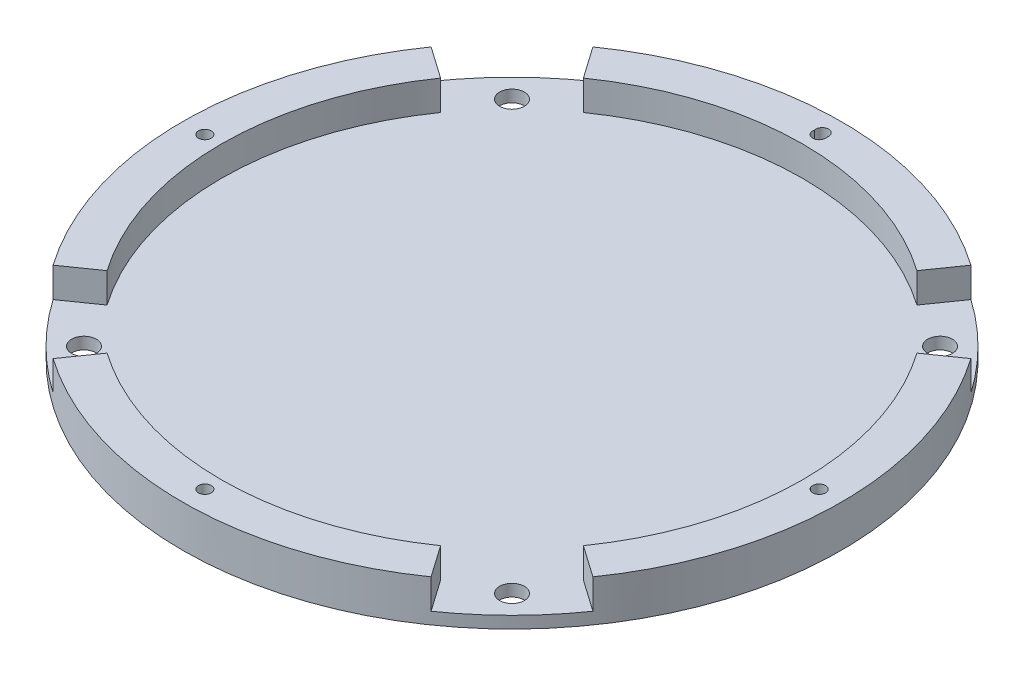
ISO-10303-21;
HEADER;
FILE_DESCRIPTION(('STEP AP214'),'2;1');
FILE_NAME('part.step','',(''),(''),'','','');
FILE_SCHEMA(('AUTOMOTIVE_DESIGN { 1 0 10303 214 1 1 1 1 }'));
ENDSEC;
DATA;
#1=APPLICATION_CONTEXT('core data for automotive mechanical design processes');
#2=APPLICATION_PROTOCOL_DEFINITION('international standard','automotive_design',2000,#1);
#3=PRODUCT_CONTEXT('',#1,'mechanical');
#4=PRODUCT('Part','Part','',(#3));
#5=PRODUCT_RELATED_PRODUCT_CATEGORY('part','',(#4));
#6=PRODUCT_DEFINITION_FORMATION('','',#4);
#7=PRODUCT_DEFINITION_CONTEXT('part definition',#1,'design');
#8=PRODUCT_DEFINITION('design','',#6,#7);
#9=PRODUCT_DEFINITION_SHAPE('','',#8);
#10=(LENGTH_UNIT() NAMED_UNIT(*) SI_UNIT(.MILLI.,.METRE.));
#11=(NAMED_UNIT(*) PLANE_ANGLE_UNIT() SI_UNIT($,.RADIAN.));
#12=(NAMED_UNIT(*) SI_UNIT($,.STERADIAN.) SOLID_ANGLE_UNIT());
#13=UNCERTAINTY_MEASURE_WITH_UNIT(LENGTH_MEASURE(1.E-05),#10,'distance_accuracy_value','');
#14=(GEOMETRIC_REPRESENTATION_CONTEXT(3) GLOBAL_UNCERTAINTY_ASSIGNED_CONTEXT((#13)) GLOBAL_UNIT_ASSIGNED_CONTEXT((#10,
#11,#12)) REPRESENTATION_CONTEXT('',''));
#15=CARTESIAN_POINT('',(0.,0.,0.));
#16=DIRECTION('',(0.,0.,1.));
#17=DIRECTION('',(1.,0.,0.));
#18=AXIS2_PLACEMENT_3D('',#15,#16,#17);
#19=CARTESIAN_POINT('',(0.,4.,0.));
#20=DIRECTION('',(0.,1.,0.));
#21=DIRECTION('',(0.,0.,1.));
#22=AXIS2_PLACEMENT_3D('',#19,#20,#21);
#23=PLANE('',#22);
#24=CARTESIAN_POINT('',(71.7713382904342,4.,71.7713382904349));
#25=DIRECTION('',(0.,1.,0.));
#26=DIRECTION('',(0.,0.,1.));
#27=AXIS2_PLACEMENT_3D('',#24,#25,#26);
#28=CIRCLE('',#27,4.14999999999998);
#29=CARTESIAN_POINT('',(71.7713382904342,4.,75.9213382904349));
#30=VERTEX_POINT('',#29);
#31=EDGE_CURVE('E378',#30,#30,#28,.T.);
#32=ORIENTED_EDGE('',*,*,#31,.F.);
#33=EDGE_LOOP('',(#32));
#34=FACE_BOUND('',#33,.T.);
#35=CARTESIAN_POINT('',(-71.7713382904342,4.,-71.7713382904349));
#36=DIRECTION('',(0.,1.,0.));
#37=DIRECTION('',(0.,0.,1.));
#38=AXIS2_PLACEMENT_3D('',#35,#36,#37);
#39=CIRCLE('',#38,4.15);
#40=CARTESIAN_POINT('',(-71.7713382904342,4.,-67.6213382904349));
#41=VERTEX_POINT('',#40);
#42=EDGE_CURVE('E394',#41,#41,#39,.T.);
#43=ORIENTED_EDGE('',*,*,#42,.F.);
#44=EDGE_LOOP('',(#43));
#45=FACE_BOUND('',#44,.T.);
#46=CARTESIAN_POINT('',(71.7713382904349,4.,-71.7713382904342));
#47=DIRECTION('',(0.,1.,0.));
#48=DIRECTION('',(0.,0.,1.));
#49=AXIS2_PLACEMENT_3D('',#46,#47,#48);
#50=CIRCLE('',#49,4.15);
#51=CARTESIAN_POINT('',(71.7713382904349,4.,-67.6213382904342));
#52=VERTEX_POINT('',#51);
#53=EDGE_CURVE('E386',#52,#52,#50,.T.);
#54=ORIENTED_EDGE('',*,*,#53,.F.);
#55=EDGE_LOOP('',(#54));
#56=FACE_BOUND('',#55,.T.);
#57=CARTESIAN_POINT('',(-71.7713382904349,4.,71.7713382904342));
#58=DIRECTION('',(0.,1.,0.));
#59=DIRECTION('',(0.,0.,1.));
#60=AXIS2_PLACEMENT_3D('',#57,#58,#59);
#61=CIRCLE('',#60,4.15000000000001);
#62=CARTESIAN_POINT('',(-71.7713382904349,4.,75.9213382904342));
#63=VERTEX_POINT('',#62);
#64=EDGE_CURVE('E370',#63,#63,#61,.T.);
#65=ORIENTED_EDGE('',*,*,#64,.F.);
#66=EDGE_LOOP('',(#65));
#67=FACE_BOUND('',#66,.T.);
#68=CARTESIAN_POINT('',(0.,4.,0.));
#69=DIRECTION('',(0.,1.,0.));
#70=DIRECTION('',(0.,0.,1.));
#71=AXIS2_PLACEMENT_3D('',#68,#69,#70);
#72=CIRCLE('',#71,110.5);
#73=CARTESIAN_POINT('',(-63.3801962167911,4.,-90.5163008939333));
#74=VERTEX_POINT('',#73);
#75=CARTESIAN_POINT('',(-90.5163008939334,4.,-63.3801962167909));
#76=VERTEX_POINT('',#75);
#77=EDGE_CURVE('E11',#74,#76,#72,.T.);
#78=ORIENTED_EDGE('',*,*,#77,.T.);
#79=DIRECTION('',(-0.819152044288995,0.,-0.573576436351042));
#80=VECTOR('',#79,1.);
#81=CARTESIAN_POINT('',(5.09438212815498E-13,4.,-7.27553168190726E-13));
#82=LINE('',#81,#80);
#83=CARTESIAN_POINT('',(-79.8673243181765,4.,-55.9237025442273));
#84=VERTEX_POINT('',#83);
#85=EDGE_CURVE('E62',#84,#76,#82,.T.);
#86=ORIENTED_EDGE('',*,*,#85,.F.);
#87=CARTESIAN_POINT('',(0.,4.,0.));
#88=DIRECTION('',(0.,1.,0.));
#89=DIRECTION('',(0.,0.,1.));
#90=AXIS2_PLACEMENT_3D('',#87,#88,#89);
#91=CIRCLE('',#90,97.5);
#92=CARTESIAN_POINT('',(-79.8673243181764,4.,55.9237025442275));
#93=VERTEX_POINT('',#92);
#94=EDGE_CURVE('E67',#84,#93,#91,.T.);
#95=ORIENTED_EDGE('',*,*,#94,.T.);
#96=DIRECTION('',(-0.819152044288988,0.,0.573576436351052));
#97=VECTOR('',#96,1.);
#98=CARTESIAN_POINT('',(0.,4.,0.));
#99=LINE('',#98,#97);
#100=CARTESIAN_POINT('',(-90.5163008939332,4.,63.3801962167912));
#101=VERTEX_POINT('',#100);
#102=EDGE_CURVE('E196',#93,#101,#99,.T.);
#103=ORIENTED_EDGE('',*,*,#102,.T.);
#104=CARTESIAN_POINT('',(-63.3801962167914,4.,90.5163008939331));
#105=VERTEX_POINT('',#104);
#106=EDGE_CURVE('E55',#101,#105,#72,.T.);
#107=ORIENTED_EDGE('',*,*,#106,.T.);
#108=DIRECTION('',(-0.573576436351053,0.,0.819152044288987));
#109=VECTOR('',#108,1.);
#110=CARTESIAN_POINT('',(0.,4.,0.));
#111=LINE('',#110,#109);
#112=CARTESIAN_POINT('',(-55.9237025442277,4.,79.8673243181762));
#113=VERTEX_POINT('',#112);
#114=EDGE_CURVE('E244',#113,#105,#111,.T.);
#115=ORIENTED_EDGE('',*,*,#114,.F.);
#116=CARTESIAN_POINT('',(0.,4.,0.));
#117=DIRECTION('',(0.,1.,0.));
#118=DIRECTION('',(0.,0.,1.));
#119=AXIS2_PLACEMENT_3D('',#116,#117,#118);
#120=CIRCLE('',#119,97.5);
#121=CARTESIAN_POINT('',(55.9237025442275,4.,79.8673243181763));
#122=VERTEX_POINT('',#121);
#123=EDGE_CURVE('E179',#113,#122,#120,.T.);
#124=ORIENTED_EDGE('',*,*,#123,.T.);
#125=DIRECTION('',(0.573576436351042,0.,0.819152044288994));
#126=VECTOR('',#125,1.);
#127=CARTESIAN_POINT('',(8.81021414605957E-13,4.,-6.16897835831267E-13));
#128=LINE('',#127,#126);
#129=CARTESIAN_POINT('',(63.3801962167911,4.,90.5163008939333));
#130=VERTEX_POINT('',#129);
#131=EDGE_CURVE('E227',#122,#130,#128,.T.);
#132=ORIENTED_EDGE('',*,*,#131,.T.);
#133=CARTESIAN_POINT('',(90.5163008939333,4.,63.380196216791));
#134=VERTEX_POINT('',#133);
#135=EDGE_CURVE('E427',#130,#134,#72,.T.);
#136=ORIENTED_EDGE('',*,*,#135,.T.);
#137=DIRECTION('',(0.819152044288989,0.,0.57357643635105));
#138=VECTOR('',#137,1.);
#139=CARTESIAN_POINT('',(0.,4.,0.));
#140=LINE('',#139,#138);
#141=CARTESIAN_POINT('',(79.8673243181764,4.,55.9237025442274));
#142=VERTEX_POINT('',#141);
#143=EDGE_CURVE('E289',#142,#134,#140,.T.);
#144=ORIENTED_EDGE('',*,*,#143,.F.);
#145=CARTESIAN_POINT('',(0.,4.,0.));
#146=DIRECTION('',(0.,1.,0.));
#147=DIRECTION('',(0.,0.,1.));
#148=AXIS2_PLACEMENT_3D('',#145,#146,#147);
#149=CIRCLE('',#148,97.5);
#150=CARTESIAN_POINT('',(79.8673243181768,4.,-55.9237025442269));
#151=VERTEX_POINT('',#150);
#152=EDGE_CURVE('E266',#142,#151,#149,.T.);
#153=ORIENTED_EDGE('',*,*,#152,.T.);
#154=DIRECTION('',(0.819152044288993,0.,-0.573576436351045));
#155=VECTOR('',#154,1.);
#156=CARTESIAN_POINT('',(0.,4.,0.));
#157=LINE('',#156,#155);
#158=CARTESIAN_POINT('',(90.5163008939337,4.,-63.3801962167905));
#159=VERTEX_POINT('',#158);
#160=EDGE_CURVE('E272',#151,#159,#157,.T.);
#161=ORIENTED_EDGE('',*,*,#160,.T.);
#162=CARTESIAN_POINT('',(63.3801962167907,4.,-90.5163008939335));
#163=VERTEX_POINT('',#162);
#164=EDGE_CURVE('E56',#159,#163,#72,.T.);
#165=ORIENTED_EDGE('',*,*,#164,.T.);
#166=DIRECTION('',(0.573576436351047,0.,-0.819152044288991));
#167=VECTOR('',#166,1.);
#168=CARTESIAN_POINT('',(0.,4.,0.));
#169=LINE('',#168,#167);
#170=CARTESIAN_POINT('',(55.9237025442271,4.,-79.8673243181766));
#171=VERTEX_POINT('',#170);
#172=EDGE_CURVE('E342',#171,#163,#169,.T.);
#173=ORIENTED_EDGE('',*,*,#172,.F.);
#174=CARTESIAN_POINT('',(0.,4.,0.));
#175=DIRECTION('',(0.,1.,0.));
#176=DIRECTION('',(0.,0.,1.));
#177=AXIS2_PLACEMENT_3D('',#174,#175,#176);
#178=CIRCLE('',#177,97.5);
#179=CARTESIAN_POINT('',(-55.9237025442275,4.,-79.8673243181763));
#180=VERTEX_POINT('',#179);
#181=EDGE_CURVE('E339',#171,#180,#178,.T.);
#182=ORIENTED_EDGE('',*,*,#181,.T.);
#183=DIRECTION('',(-0.573576436351048,0.,-0.81915204428899));
#184=VECTOR('',#183,1.);
#185=CARTESIAN_POINT('',(-2.72832438071521E-13,4.,1.91039329805814E-13));
#186=LINE('',#185,#184);
#187=EDGE_CURVE('E317',#180,#74,#186,.T.);
#188=ORIENTED_EDGE('',*,*,#187,.T.);
#189=EDGE_LOOP('',(#78,#86,#95,#103,#107,#115,#124,#132,#136,#144,#153,#161,#165,#173,#182,#188));
#190=FACE_BOUND('',#189,.T.);
#191=ADVANCED_FACE('F45',(#34,#45,#56,#67,#190),#23,.T.);
#192=CARTESIAN_POINT('',(0.,4.,-103.));
#193=DIRECTION('',(0.,1.,0.));
#194=DIRECTION('',(0.,0.,1.));
#195=AXIS2_PLACEMENT_3D('',#192,#193,#194);
#196=CIRCLE('',#195,2.15);
#197=CARTESIAN_POINT('',(2.09105236663265,4.,-103.5));
#198=VERTEX_POINT('',#197);
#199=CARTESIAN_POINT('',(-2.09105236663265,4.,-103.5));
#200=VERTEX_POINT('',#199);
#201=EDGE_CURVE('E410',#198,#200,#196,.T.);
#202=ORIENTED_EDGE('',*,*,#201,.F.);
#203=CARTESIAN_POINT('',(0.,4.,-104.));
#204=DIRECTION('',(0.,1.,0.));
#205=DIRECTION('',(0.,0.,1.));
#206=AXIS2_PLACEMENT_3D('',#203,#204,#205);
#207=CIRCLE('',#206,2.15);
#208=EDGE_CURVE('E311',#198,#200,#207,.T.);
#209=ORIENTED_EDGE('',*,*,#208,.T.);
#210=EDGE_LOOP('',(#202,#209));
#211=FACE_BOUND('',#210,.T.);
#212=ADVANCED_FACE('F460',(#211),#23,.T.);
#213=CARTESIAN_POINT('',(0.,0.,0.));
#214=DIRECTION('',(0.,1.,0.));
#215=DIRECTION('',(0.,0.,1.));
#216=AXIS2_PLACEMENT_3D('',#213,#214,#215);
#217=PLANE('',#216);
#218=CARTESIAN_POINT('',(0.,0.,0.));
#219=DIRECTION('',(0.,1.,0.));
#220=DIRECTION('',(0.,0.,1.));
#221=AXIS2_PLACEMENT_3D('',#218,#219,#220);
#222=CIRCLE('',#221,110.5);
#223=CARTESIAN_POINT('',(0.,0.,110.5));
#224=VERTEX_POINT('',#223);
#225=EDGE_CURVE('E49',#224,#224,#222,.T.);
#226=ORIENTED_EDGE('',*,*,#225,.F.);
#227=EDGE_LOOP('',(#226));
#228=FACE_BOUND('',#227,.T.);
#229=CARTESIAN_POINT('',(-103.,0.,0.));
#230=DIRECTION('',(0.,1.,0.));
#231=DIRECTION('',(0.,0.,1.));
#232=AXIS2_PLACEMENT_3D('',#229,#230,#231);
#233=CIRCLE('',#232,2.15);
#234=CARTESIAN_POINT('',(-103.,0.,2.15));
#235=VERTEX_POINT('',#234);
#236=EDGE_CURVE('E414',#235,#235,#233,.T.);
#237=ORIENTED_EDGE('',*,*,#236,.T.);
#238=EDGE_LOOP('',(#237));
#239=FACE_BOUND('',#238,.T.);
#240=CARTESIAN_POINT('',(0.,0.,-103.));
#241=DIRECTION('',(0.,1.,0.));
#242=DIRECTION('',(0.,0.,1.));
#243=AXIS2_PLACEMENT_3D('',#240,#241,#242);
#244=CIRCLE('',#243,2.15);
#245=CARTESIAN_POINT('',(0.,0.,-100.85));
#246=VERTEX_POINT('',#245);
#247=EDGE_CURVE('E409',#246,#246,#244,.T.);
#248=ORIENTED_EDGE('',*,*,#247,.T.);
#249=EDGE_LOOP('',(#248));
#250=FACE_BOUND('',#249,.T.);
#251=CARTESIAN_POINT('',(103.,0.,0.));
#252=DIRECTION('',(0.,1.,0.));
#253=DIRECTION('',(0.,0.,1.));
#254=AXIS2_PLACEMENT_3D('',#251,#252,#253);
#255=CIRCLE('',#254,2.15);
#256=CARTESIAN_POINT('',(103.,0.,2.15));
#257=VERTEX_POINT('',#256);
#258=EDGE_CURVE('E405',#257,#257,#255,.T.);
#259=ORIENTED_EDGE('',*,*,#258,.T.);
#260=EDGE_LOOP('',(#259));
#261=FACE_BOUND('',#260,.T.);
#262=CARTESIAN_POINT('',(0.,0.,103.));
#263=DIRECTION('',(0.,1.,0.));
#264=DIRECTION('',(0.,0.,1.));
#265=AXIS2_PLACEMENT_3D('',#262,#263,#264);
#266=CIRCLE('',#265,2.15);
#267=CARTESIAN_POINT('',(0.,0.,105.15));
#268=VERTEX_POINT('',#267);
#269=EDGE_CURVE('E398',#268,#268,#266,.T.);
#270=ORIENTED_EDGE('',*,*,#269,.T.);
#271=EDGE_LOOP('',(#270));
#272=FACE_BOUND('',#271,.T.);
#273=CARTESIAN_POINT('',(-71.7713382904342,0.,-71.7713382904349));
#274=DIRECTION('',(0.,1.,0.));
#275=DIRECTION('',(0.,0.,1.));
#276=AXIS2_PLACEMENT_3D('',#273,#274,#275);
#277=CIRCLE('',#276,4.15);
#278=CARTESIAN_POINT('',(-71.7713382904342,0.,-67.6213382904349));
#279=VERTEX_POINT('',#278);
#280=EDGE_CURVE('E390',#279,#279,#277,.T.);
#281=ORIENTED_EDGE('',*,*,#280,.T.);
#282=EDGE_LOOP('',(#281));
#283=FACE_BOUND('',#282,.T.);
#284=CARTESIAN_POINT('',(71.7713382904349,0.,-71.7713382904342));
#285=DIRECTION('',(0.,1.,0.));
#286=DIRECTION('',(0.,0.,1.));
#287=AXIS2_PLACEMENT_3D('',#284,#285,#286);
#288=CIRCLE('',#287,4.15);
#289=CARTESIAN_POINT('',(71.7713382904349,0.,-67.6213382904342));
#290=VERTEX_POINT('',#289);
#291=EDGE_CURVE('E382',#290,#290,#288,.T.);
#292=ORIENTED_EDGE('',*,*,#291,.T.);
#293=EDGE_LOOP('',(#292));
#294=FACE_BOUND('',#293,.T.);
#295=CARTESIAN_POINT('',(71.7713382904342,0.,71.7713382904349));
#296=DIRECTION('',(0.,1.,0.));
#297=DIRECTION('',(0.,0.,1.));
#298=AXIS2_PLACEMENT_3D('',#295,#296,#297);
#299=CIRCLE('',#298,4.14999999999998);
#300=CARTESIAN_POINT('',(71.7713382904342,0.,75.9213382904349));
#301=VERTEX_POINT('',#300);
#302=EDGE_CURVE('E374',#301,#301,#299,.T.);
#303=ORIENTED_EDGE('',*,*,#302,.T.);
#304=EDGE_LOOP('',(#303));
#305=FACE_BOUND('',#304,.T.);
#306=CARTESIAN_POINT('',(-71.7713382904349,0.,71.7713382904342));
#307=DIRECTION('',(0.,1.,0.));
#308=DIRECTION('',(0.,0.,1.));
#309=AXIS2_PLACEMENT_3D('',#306,#307,#308);
#310=CIRCLE('',#309,4.15000000000001);
#311=CARTESIAN_POINT('',(-71.7713382904349,0.,75.9213382904342));
#312=VERTEX_POINT('',#311);
#313=EDGE_CURVE('E365',#312,#312,#310,.T.);
#314=ORIENTED_EDGE('',*,*,#313,.T.);
#315=EDGE_LOOP('',(#314));
#316=FACE_BOUND('',#315,.T.);
#317=ADVANCED_FACE('F466',(#228,#239,#250,#261,#272,#283,#294,#305,#316),#217,.F.);
#318=CARTESIAN_POINT('',(0.,4.,0.));
#319=DIRECTION('',(0.,-1.,0.));
#320=DIRECTION('',(0.,0.,-1.));
#321=AXIS2_PLACEMENT_3D('',#318,#319,#320);
#322=CYLINDRICAL_SURFACE('',#321,110.5);
#323=ORIENTED_EDGE('',*,*,#77,.F.);
#324=DIRECTION('',(0.,-1.,0.));
#325=VECTOR('',#324,1.);
#326=CARTESIAN_POINT('',(-63.3801962167911,14.,-90.5163008939333));
#327=LINE('',#326,#325);
#328=CARTESIAN_POINT('',(-63.3801962167911,14.,-90.5163008939333));
#329=VERTEX_POINT('',#328);
#330=EDGE_CURVE('E352',#329,#74,#327,.T.);
#331=ORIENTED_EDGE('',*,*,#330,.F.);
#332=CARTESIAN_POINT('',(0.,14.,0.));
#333=DIRECTION('',(0.,1.,0.));
#334=DIRECTION('',(0.,0.,1.));
#335=AXIS2_PLACEMENT_3D('',#332,#333,#334);
#336=CIRCLE('',#335,110.5);
#337=CARTESIAN_POINT('',(63.3801962167907,14.,-90.5163008939335));
#338=VERTEX_POINT('',#337);
#339=EDGE_CURVE('E328',#338,#329,#336,.T.);
#340=ORIENTED_EDGE('',*,*,#339,.F.);
#341=DIRECTION('',(0.,-1.,0.));
#342=VECTOR('',#341,1.);
#343=CARTESIAN_POINT('',(63.3801962167907,14.,-90.5163008939335));
#344=LINE('',#343,#342);
#345=EDGE_CURVE('E357',#338,#163,#344,.T.);
#346=ORIENTED_EDGE('',*,*,#345,.T.);
#347=ORIENTED_EDGE('',*,*,#164,.F.);
#348=DIRECTION('',(0.,-1.,0.));
#349=VECTOR('',#348,1.);
#350=CARTESIAN_POINT('',(90.5163008939337,14.,-63.3801962167905));
#351=LINE('',#350,#349);
#352=CARTESIAN_POINT('',(90.5163008939337,14.,-63.3801962167905));
#353=VERTEX_POINT('',#352);
#354=EDGE_CURVE('E299',#353,#159,#351,.T.);
#355=ORIENTED_EDGE('',*,*,#354,.F.);
#356=CARTESIAN_POINT('',(0.,14.,0.));
#357=DIRECTION('',(0.,1.,0.));
#358=DIRECTION('',(0.,0.,1.));
#359=AXIS2_PLACEMENT_3D('',#356,#357,#358);
#360=CIRCLE('',#359,110.5);
#361=CARTESIAN_POINT('',(90.5163008939333,14.,63.380196216791));
#362=VERTEX_POINT('',#361);
#363=EDGE_CURVE('E275',#362,#353,#360,.T.);
#364=ORIENTED_EDGE('',*,*,#363,.F.);
#365=DIRECTION('',(0.,-1.,0.));
#366=VECTOR('',#365,1.);
#367=CARTESIAN_POINT('',(90.5163008939333,14.,63.380196216791));
#368=LINE('',#367,#366);
#369=EDGE_CURVE('E303',#362,#134,#368,.T.);
#370=ORIENTED_EDGE('',*,*,#369,.T.);
#371=ORIENTED_EDGE('',*,*,#135,.F.);
#372=DIRECTION('',(0.,-1.,0.));
#373=VECTOR('',#372,1.);
#374=CARTESIAN_POINT('',(63.3801962167911,14.,90.5163008939333));
#375=LINE('',#374,#373);
#376=CARTESIAN_POINT('',(63.3801962167911,14.,90.5163008939333));
#377=VERTEX_POINT('',#376);
#378=EDGE_CURVE('E254',#377,#130,#375,.T.);
#379=ORIENTED_EDGE('',*,*,#378,.F.);
#380=CARTESIAN_POINT('',(0.,14.,0.));
#381=DIRECTION('',(0.,1.,0.));
#382=DIRECTION('',(0.,0.,1.));
#383=AXIS2_PLACEMENT_3D('',#380,#381,#382);
#384=CIRCLE('',#383,110.5);
#385=CARTESIAN_POINT('',(-63.3801962167914,14.,90.5163008939331));
#386=VERTEX_POINT('',#385);
#387=EDGE_CURVE('E230',#386,#377,#384,.T.);
#388=ORIENTED_EDGE('',*,*,#387,.F.);
#389=DIRECTION('',(0.,-1.,0.));
#390=VECTOR('',#389,1.);
#391=CARTESIAN_POINT('',(-63.3801962167914,14.,90.5163008939331));
#392=LINE('',#391,#390);
#393=EDGE_CURVE('E258',#386,#105,#392,.T.);
#394=ORIENTED_EDGE('',*,*,#393,.T.);
#395=ORIENTED_EDGE('',*,*,#106,.F.);
#396=DIRECTION('',(0.,-1.,0.));
#397=VECTOR('',#396,1.);
#398=CARTESIAN_POINT('',(-90.5163008939332,14.,63.3801962167912));
#399=LINE('',#398,#397);
#400=CARTESIAN_POINT('',(-90.5163008939332,14.,63.3801962167912));
#401=VERTEX_POINT('',#400);
#402=EDGE_CURVE('E216',#401,#101,#399,.T.);
#403=ORIENTED_EDGE('',*,*,#402,.F.);
#404=CARTESIAN_POINT('',(0.,14.,0.));
#405=DIRECTION('',(0.,1.,0.));
#406=DIRECTION('',(0.,0.,1.));
#407=AXIS2_PLACEMENT_3D('',#404,#405,#406);
#408=CIRCLE('',#407,110.5);
#409=CARTESIAN_POINT('',(-90.5163008939334,14.,-63.3801962167909));
#410=VERTEX_POINT('',#409);
#411=EDGE_CURVE('E189',#410,#401,#408,.T.);
#412=ORIENTED_EDGE('',*,*,#411,.F.);
#413=DIRECTION('',(0.,-1.,0.));
#414=VECTOR('',#413,1.);
#415=CARTESIAN_POINT('',(-90.5163008939334,14.,-63.3801962167909));
#416=LINE('',#415,#414);
#417=EDGE_CURVE('E180',#410,#76,#416,.T.);
#418=ORIENTED_EDGE('',*,*,#417,.T.);
#419=EDGE_LOOP('',(#323,#331,#340,#346,#347,#355,#364,#370,#371,#379,#388,#394,#395,#403,#412,#418));
#420=FACE_BOUND('',#419,.T.);
#421=ORIENTED_EDGE('',*,*,#225,.T.);
#422=EDGE_LOOP('',(#421));
#423=FACE_BOUND('',#422,.T.);
#424=ADVANCED_FACE('F47',(#420,#423),#322,.T.);
#425=CARTESIAN_POINT('',(-103.,4.,0.));
#426=DIRECTION('',(0.,-1.,0.));
#427=DIRECTION('',(0.,0.,-1.));
#428=AXIS2_PLACEMENT_3D('',#425,#426,#427);
#429=CYLINDRICAL_SURFACE('',#428,2.15);
#430=ORIENTED_EDGE('',*,*,#236,.F.);
#431=EDGE_LOOP('',(#430));
#432=FACE_BOUND('',#431,.T.);
#433=CARTESIAN_POINT('',(-103.,14.,0.));
#434=DIRECTION('',(0.,1.,0.));
#435=DIRECTION('',(0.,0.,1.));
#436=AXIS2_PLACEMENT_3D('',#433,#434,#435);
#437=CIRCLE('',#436,2.15);
#438=CARTESIAN_POINT('',(-103.,14.,2.15));
#439=VERTEX_POINT('',#438);
#440=EDGE_CURVE('E205',#439,#439,#437,.F.);
#441=ORIENTED_EDGE('',*,*,#440,.F.);
#442=EDGE_LOOP('',(#441));
#443=FACE_BOUND('',#442,.T.);
#444=ADVANCED_FACE('F471',(#432,#443),#429,.F.);
#445=CARTESIAN_POINT('',(0.,4.,-103.));
#446=DIRECTION('',(0.,-1.,0.));
#447=DIRECTION('',(0.,0.,-1.));
#448=AXIS2_PLACEMENT_3D('',#445,#446,#447);
#449=CYLINDRICAL_SURFACE('',#448,2.15);
#450=ORIENTED_EDGE('',*,*,#201,.T.);
#451=DIRECTION('',(0.,-1.,0.));
#452=VECTOR('',#451,1.);
#453=CARTESIAN_POINT('',(-2.09105236663265,14.,-103.5));
#454=LINE('',#453,#452);
#455=CARTESIAN_POINT('',(-2.09105236663265,14.,-103.5));
#456=VERTEX_POINT('',#455);
#457=EDGE_CURVE('E335',#456,#200,#454,.T.);
#458=ORIENTED_EDGE('',*,*,#457,.F.);
#459=CARTESIAN_POINT('',(0.,14.,-103.));
#460=DIRECTION('',(0.,1.,0.));
#461=DIRECTION('',(0.,0.,1.));
#462=AXIS2_PLACEMENT_3D('',#459,#460,#461);
#463=CIRCLE('',#462,2.15);
#464=CARTESIAN_POINT('',(2.09105236663265,14.,-103.5));
#465=VERTEX_POINT('',#464);
#466=EDGE_CURVE('E316',#465,#456,#463,.F.);
#467=ORIENTED_EDGE('',*,*,#466,.F.);
#468=DIRECTION('',(0.,-1.,0.));
#469=VECTOR('',#468,1.);
#470=CARTESIAN_POINT('',(2.09105236663265,14.,-103.5));
#471=LINE('',#470,#469);
#472=EDGE_CURVE('E353',#465,#198,#471,.T.);
#473=ORIENTED_EDGE('',*,*,#472,.T.);
#474=EDGE_LOOP('',(#450,#458,#467,#473));
#475=FACE_BOUND('',#474,.T.);
#476=ORIENTED_EDGE('',*,*,#247,.F.);
#477=EDGE_LOOP('',(#476));
#478=FACE_BOUND('',#477,.T.);
#479=ADVANCED_FACE('F525',(#475,#478),#449,.F.);
#480=CARTESIAN_POINT('',(103.,4.,0.));
#481=DIRECTION('',(0.,-1.,0.));
#482=DIRECTION('',(0.,0.,-1.));
#483=AXIS2_PLACEMENT_3D('',#480,#481,#482);
#484=CYLINDRICAL_SURFACE('',#483,2.15);
#485=ORIENTED_EDGE('',*,*,#258,.F.);
#486=EDGE_LOOP('',(#485));
#487=FACE_BOUND('',#486,.T.);
#488=CARTESIAN_POINT('',(103.,14.,0.));
#489=DIRECTION('',(0.,1.,0.));
#490=DIRECTION('',(0.,0.,1.));
#491=AXIS2_PLACEMENT_3D('',#488,#489,#490);
#492=CIRCLE('',#491,2.15);
#493=CARTESIAN_POINT('',(103.,14.,2.15));
#494=VERTEX_POINT('',#493);
#495=EDGE_CURVE('E282',#494,#494,#492,.F.);
#496=ORIENTED_EDGE('',*,*,#495,.F.);
#497=EDGE_LOOP('',(#496));
#498=FACE_BOUND('',#497,.T.);
#499=ADVANCED_FACE('F522',(#487,#498),#484,.F.);
#500=CARTESIAN_POINT('',(0.,4.,103.));
#501=DIRECTION('',(0.,-1.,0.));
#502=DIRECTION('',(0.,0.,-1.));
#503=AXIS2_PLACEMENT_3D('',#500,#501,#502);
#504=CYLINDRICAL_SURFACE('',#503,2.15);
#505=ORIENTED_EDGE('',*,*,#269,.F.);
#506=EDGE_LOOP('',(#505));
#507=FACE_BOUND('',#506,.T.);
#508=CARTESIAN_POINT('',(0.,14.,103.));
#509=DIRECTION('',(0.,1.,0.));
#510=DIRECTION('',(0.,0.,1.));
#511=AXIS2_PLACEMENT_3D('',#508,#509,#510);
#512=CIRCLE('',#511,2.15);
#513=CARTESIAN_POINT('',(0.,14.,105.15));
#514=VERTEX_POINT('',#513);
#515=EDGE_CURVE('E237',#514,#514,#512,.F.);
#516=ORIENTED_EDGE('',*,*,#515,.F.);
#517=EDGE_LOOP('',(#516));
#518=FACE_BOUND('',#517,.T.);
#519=ADVANCED_FACE('F518',(#507,#518),#504,.F.);
#520=CARTESIAN_POINT('',(-71.7713382904342,4.,-71.7713382904349));
#521=DIRECTION('',(0.,-1.,0.));
#522=DIRECTION('',(0.,0.,-1.));
#523=AXIS2_PLACEMENT_3D('',#520,#521,#522);
#524=CYLINDRICAL_SURFACE('',#523,4.15);
#525=ORIENTED_EDGE('',*,*,#42,.T.);
#526=EDGE_LOOP('',(#525));
#527=FACE_BOUND('',#526,.T.);
#528=ORIENTED_EDGE('',*,*,#280,.F.);
#529=EDGE_LOOP('',(#528));
#530=FACE_BOUND('',#529,.T.);
#531=ADVANCED_FACE('F514',(#527,#530),#524,.F.);
#532=CARTESIAN_POINT('',(71.7713382904349,4.,-71.7713382904342));
#533=DIRECTION('',(0.,-1.,0.));
#534=DIRECTION('',(0.,0.,-1.));
#535=AXIS2_PLACEMENT_3D('',#532,#533,#534);
#536=CYLINDRICAL_SURFACE('',#535,4.15);
#537=ORIENTED_EDGE('',*,*,#53,.T.);
#538=EDGE_LOOP('',(#537));
#539=FACE_BOUND('',#538,.T.);
#540=ORIENTED_EDGE('',*,*,#291,.F.);
#541=EDGE_LOOP('',(#540));
#542=FACE_BOUND('',#541,.T.);
#543=ADVANCED_FACE('F506',(#539,#542),#536,.F.);
#544=CARTESIAN_POINT('',(71.7713382904342,4.,71.7713382904349));
#545=DIRECTION('',(0.,-1.,0.));
#546=DIRECTION('',(0.,0.,-1.));
#547=AXIS2_PLACEMENT_3D('',#544,#545,#546);
#548=CYLINDRICAL_SURFACE('',#547,4.14999999999998);
#549=ORIENTED_EDGE('',*,*,#31,.T.);
#550=EDGE_LOOP('',(#549));
#551=FACE_BOUND('',#550,.T.);
#552=ORIENTED_EDGE('',*,*,#302,.F.);
#553=EDGE_LOOP('',(#552));
#554=FACE_BOUND('',#553,.T.);
#555=ADVANCED_FACE('F496',(#551,#554),#548,.F.);
#556=CARTESIAN_POINT('',(-71.7713382904349,4.,71.7713382904342));
#557=DIRECTION('',(0.,-1.,0.));
#558=DIRECTION('',(0.,0.,-1.));
#559=AXIS2_PLACEMENT_3D('',#556,#557,#558);
#560=CYLINDRICAL_SURFACE('',#559,4.15000000000001);
#561=ORIENTED_EDGE('',*,*,#64,.T.);
#562=EDGE_LOOP('',(#561));
#563=FACE_BOUND('',#562,.T.);
#564=ORIENTED_EDGE('',*,*,#313,.F.);
#565=EDGE_LOOP('',(#564));
#566=FACE_BOUND('',#565,.T.);
#567=ADVANCED_FACE('F493',(#563,#566),#560,.F.);
#568=CARTESIAN_POINT('',(0.,14.,0.));
#569=DIRECTION('',(0.,-1.,0.));
#570=DIRECTION('',(0.,0.,-1.));
#571=AXIS2_PLACEMENT_3D('',#568,#569,#570);
#572=CYLINDRICAL_SURFACE('',#571,97.5);
#573=ORIENTED_EDGE('',*,*,#181,.F.);
#574=DIRECTION('',(0.,-1.,0.));
#575=VECTOR('',#574,1.);
#576=CARTESIAN_POINT('',(55.9237025442271,14.,-79.8673243181766));
#577=LINE('',#576,#575);
#578=CARTESIAN_POINT('',(55.9237025442271,14.,-79.8673243181766));
#579=VERTEX_POINT('',#578);
#580=EDGE_CURVE('E361',#579,#171,#577,.T.);
#581=ORIENTED_EDGE('',*,*,#580,.F.);
#582=CARTESIAN_POINT('',(0.,14.,0.));
#583=DIRECTION('',(0.,1.,0.));
#584=DIRECTION('',(0.,0.,1.));
#585=AXIS2_PLACEMENT_3D('',#582,#583,#584);
#586=CIRCLE('',#585,97.5);
#587=CARTESIAN_POINT('',(-55.9237025442275,14.,-79.8673243181763));
#588=VERTEX_POINT('',#587);
#589=EDGE_CURVE('E320',#579,#588,#586,.T.);
#590=ORIENTED_EDGE('',*,*,#589,.T.);
#591=DIRECTION('',(0.,-1.,0.));
#592=VECTOR('',#591,1.);
#593=CARTESIAN_POINT('',(-55.9237025442275,14.,-79.8673243181763));
#594=LINE('',#593,#592);
#595=EDGE_CURVE('E348',#588,#180,#594,.T.);
#596=ORIENTED_EDGE('',*,*,#595,.T.);
#597=EDGE_LOOP('',(#573,#581,#590,#596));
#598=FACE_BOUND('',#597,.T.);
#599=ADVANCED_FACE('F495',(#598),#572,.F.);
#600=CARTESIAN_POINT('',(0.,14.,0.));
#601=DIRECTION('',(-0.819152044288991,0.,-0.573576436351047));
#602=DIRECTION('',(-0.573576436351047,0.,0.819152044288991));
#603=AXIS2_PLACEMENT_3D('',#600,#601,#602);
#604=PLANE('',#603);
#605=ORIENTED_EDGE('',*,*,#172,.T.);
#606=ORIENTED_EDGE('',*,*,#345,.F.);
#607=DIRECTION('',(0.573576436351047,0.,-0.819152044288991));
#608=VECTOR('',#607,1.);
#609=CARTESIAN_POINT('',(0.,14.,0.));
#610=LINE('',#609,#608);
#611=EDGE_CURVE('E324',#579,#338,#610,.T.);
#612=ORIENTED_EDGE('',*,*,#611,.F.);
#613=ORIENTED_EDGE('',*,*,#580,.T.);
#614=EDGE_LOOP('',(#605,#606,#612,#613));
#615=FACE_BOUND('',#614,.T.);
#616=ADVANCED_FACE('F503',(#615),#604,.F.);
#617=CARTESIAN_POINT('',(0.,14.,-104.));
#618=DIRECTION('',(0.,-1.,0.));
#619=DIRECTION('',(0.,0.,-1.));
#620=AXIS2_PLACEMENT_3D('',#617,#618,#619);
#621=CYLINDRICAL_SURFACE('',#620,2.15);
#622=ORIENTED_EDGE('',*,*,#208,.F.);
#623=ORIENTED_EDGE('',*,*,#472,.F.);
#624=CARTESIAN_POINT('',(0.,14.,-104.));
#625=DIRECTION('',(0.,1.,0.));
#626=DIRECTION('',(0.,0.,1.));
#627=AXIS2_PLACEMENT_3D('',#624,#625,#626);
#628=CIRCLE('',#627,2.15);
#629=EDGE_CURVE('E312',#465,#456,#628,.T.);
#630=ORIENTED_EDGE('',*,*,#629,.T.);
#631=ORIENTED_EDGE('',*,*,#457,.T.);
#632=EDGE_LOOP('',(#622,#623,#630,#631));
#633=FACE_BOUND('',#632,.T.);
#634=ADVANCED_FACE('F510',(#633),#621,.F.);
#635=CARTESIAN_POINT('',(-2.72832438071521E-13,14.,1.91039329805814E-13));
#636=DIRECTION('',(-0.81915204428899,0.,0.573576436351048));
#637=DIRECTION('',(0.573576436351048,0.,0.81915204428899));
#638=AXIS2_PLACEMENT_3D('',#635,#636,#637);
#639=PLANE('',#638);
#640=ORIENTED_EDGE('',*,*,#187,.F.);
#641=ORIENTED_EDGE('',*,*,#595,.F.);
#642=DIRECTION('',(-0.573576436351048,0.,-0.81915204428899));
#643=VECTOR('',#642,1.);
#644=CARTESIAN_POINT('',(-2.72832438071521E-13,14.,1.91039329805814E-13));
#645=LINE('',#644,#643);
#646=EDGE_CURVE('E331',#588,#329,#645,.T.);
#647=ORIENTED_EDGE('',*,*,#646,.T.);
#648=ORIENTED_EDGE('',*,*,#330,.T.);
#649=EDGE_LOOP('',(#640,#641,#647,#648));
#650=FACE_BOUND('',#649,.T.);
#651=ADVANCED_FACE('F545',(#650),#639,.T.);
#652=CARTESIAN_POINT('',(0.,14.,0.));
#653=DIRECTION('',(0.,1.,0.));
#654=DIRECTION('',(0.,0.,1.));
#655=AXIS2_PLACEMENT_3D('',#652,#653,#654);
#656=PLANE('',#655);
#657=ORIENTED_EDGE('',*,*,#629,.F.);
#658=ORIENTED_EDGE('',*,*,#466,.T.);
#659=EDGE_LOOP('',(#657,#658));
#660=FACE_BOUND('',#659,.T.);
#661=ORIENTED_EDGE('',*,*,#589,.F.);
#662=ORIENTED_EDGE('',*,*,#611,.T.);
#663=ORIENTED_EDGE('',*,*,#339,.T.);
#664=ORIENTED_EDGE('',*,*,#646,.F.);
#665=EDGE_LOOP('',(#661,#662,#663,#664));
#666=FACE_BOUND('',#665,.T.);
#667=ADVANCED_FACE('F541',(#660,#666),#656,.T.);
#668=CARTESIAN_POINT('',(0.,14.,0.));
#669=DIRECTION('',(0.,-1.,0.));
#670=DIRECTION('',(0.,0.,-1.));
#671=AXIS2_PLACEMENT_3D('',#668,#669,#670);
#672=CYLINDRICAL_SURFACE('',#671,97.5);
#673=ORIENTED_EDGE('',*,*,#152,.F.);
#674=DIRECTION('',(0.,-1.,0.));
#675=VECTOR('',#674,1.);
#676=CARTESIAN_POINT('',(79.8673243181764,14.,55.9237025442274));
#677=LINE('',#676,#675);
#678=CARTESIAN_POINT('',(79.8673243181764,14.,55.9237025442274));
#679=VERTEX_POINT('',#678);
#680=EDGE_CURVE('E307',#679,#142,#677,.T.);
#681=ORIENTED_EDGE('',*,*,#680,.F.);
#682=CARTESIAN_POINT('',(0.,14.,0.));
#683=DIRECTION('',(0.,1.,0.));
#684=DIRECTION('',(0.,0.,1.));
#685=AXIS2_PLACEMENT_3D('',#682,#683,#684);
#686=CIRCLE('',#685,97.5);
#687=CARTESIAN_POINT('',(79.8673243181768,14.,-55.9237025442269));
#688=VERTEX_POINT('',#687);
#689=EDGE_CURVE('E267',#679,#688,#686,.T.);
#690=ORIENTED_EDGE('',*,*,#689,.T.);
#691=DIRECTION('',(0.,-1.,0.));
#692=VECTOR('',#691,1.);
#693=CARTESIAN_POINT('',(79.8673243181768,14.,-55.9237025442269));
#694=LINE('',#693,#692);
#695=EDGE_CURVE('E286',#688,#151,#694,.T.);
#696=ORIENTED_EDGE('',*,*,#695,.T.);
#697=EDGE_LOOP('',(#673,#681,#690,#696));
#698=FACE_BOUND('',#697,.T.);
#699=ADVANCED_FACE('F544',(#698),#672,.F.);
#700=CARTESIAN_POINT('',(0.,14.,0.));
#701=DIRECTION('',(0.57357643635105,0.,-0.819152044288989));
#702=DIRECTION('',(-0.819152044288989,0.,-0.57357643635105));
#703=AXIS2_PLACEMENT_3D('',#700,#701,#702);
#704=PLANE('',#703);
#705=ORIENTED_EDGE('',*,*,#143,.T.);
#706=ORIENTED_EDGE('',*,*,#369,.F.);
#707=DIRECTION('',(0.819152044288989,0.,0.57357643635105));
#708=VECTOR('',#707,1.);
#709=CARTESIAN_POINT('',(0.,14.,0.));
#710=LINE('',#709,#708);
#711=EDGE_CURVE('E271',#679,#362,#710,.T.);
#712=ORIENTED_EDGE('',*,*,#711,.F.);
#713=ORIENTED_EDGE('',*,*,#680,.T.);
#714=EDGE_LOOP('',(#705,#706,#712,#713));
#715=FACE_BOUND('',#714,.T.);
#716=ADVANCED_FACE('F641',(#715),#704,.F.);
#717=CARTESIAN_POINT('',(0.,14.,0.));
#718=DIRECTION('',(-0.573576436351045,0.,-0.819152044288992));
#719=DIRECTION('',(-0.819152044288993,0.,0.573576436351045));
#720=AXIS2_PLACEMENT_3D('',#717,#718,#719);
#721=PLANE('',#720);
#722=ORIENTED_EDGE('',*,*,#160,.F.);
#723=ORIENTED_EDGE('',*,*,#695,.F.);
#724=DIRECTION('',(0.819152044288993,0.,-0.573576436351045));
#725=VECTOR('',#724,1.);
#726=CARTESIAN_POINT('',(0.,14.,0.));
#727=LINE('',#726,#725);
#728=EDGE_CURVE('E278',#688,#353,#727,.T.);
#729=ORIENTED_EDGE('',*,*,#728,.T.);
#730=ORIENTED_EDGE('',*,*,#354,.T.);
#731=EDGE_LOOP('',(#722,#723,#729,#730));
#732=FACE_BOUND('',#731,.T.);
#733=ADVANCED_FACE('F631',(#732),#721,.T.);
#734=CARTESIAN_POINT('',(0.,14.,0.));
#735=DIRECTION('',(0.,1.,0.));
#736=DIRECTION('',(0.,0.,1.));
#737=AXIS2_PLACEMENT_3D('',#734,#735,#736);
#738=PLANE('',#737);
#739=ORIENTED_EDGE('',*,*,#689,.F.);
#740=ORIENTED_EDGE('',*,*,#711,.T.);
#741=ORIENTED_EDGE('',*,*,#363,.T.);
#742=ORIENTED_EDGE('',*,*,#728,.F.);
#743=EDGE_LOOP('',(#739,#740,#741,#742));
#744=FACE_BOUND('',#743,.T.);
#745=ORIENTED_EDGE('',*,*,#495,.T.);
#746=EDGE_LOOP('',(#745));
#747=FACE_BOUND('',#746,.T.);
#748=ADVANCED_FACE('F622',(#744,#747),#738,.T.);
#749=CARTESIAN_POINT('',(0.,14.,0.));
#750=DIRECTION('',(0.,-1.,0.));
#751=DIRECTION('',(0.,0.,-1.));
#752=AXIS2_PLACEMENT_3D('',#749,#750,#751);
#753=CYLINDRICAL_SURFACE('',#752,97.5);
#754=ORIENTED_EDGE('',*,*,#123,.F.);
#755=DIRECTION('',(0.,-1.,0.));
#756=VECTOR('',#755,1.);
#757=CARTESIAN_POINT('',(-55.9237025442277,14.,79.8673243181762));
#758=LINE('',#757,#756);
#759=CARTESIAN_POINT('',(-55.9237025442277,14.,79.8673243181762));
#760=VERTEX_POINT('',#759);
#761=EDGE_CURVE('E262',#760,#113,#758,.T.);
#762=ORIENTED_EDGE('',*,*,#761,.F.);
#763=CARTESIAN_POINT('',(0.,14.,0.));
#764=DIRECTION('',(0.,1.,0.));
#765=DIRECTION('',(0.,0.,1.));
#766=AXIS2_PLACEMENT_3D('',#763,#764,#765);
#767=CIRCLE('',#766,97.5);
#768=CARTESIAN_POINT('',(55.9237025442275,14.,79.8673243181763));
#769=VERTEX_POINT('',#768);
#770=EDGE_CURVE('E222',#760,#769,#767,.T.);
#771=ORIENTED_EDGE('',*,*,#770,.T.);
#772=DIRECTION('',(0.,-1.,0.));
#773=VECTOR('',#772,1.);
#774=CARTESIAN_POINT('',(55.9237025442275,14.,79.8673243181763));
#775=LINE('',#774,#773);
#776=EDGE_CURVE('E241',#769,#122,#775,.T.);
#777=ORIENTED_EDGE('',*,*,#776,.T.);
#778=EDGE_LOOP('',(#754,#762,#771,#777));
#779=FACE_BOUND('',#778,.T.);
#780=ADVANCED_FACE('F447',(#779),#753,.F.);
#781=CARTESIAN_POINT('',(0.,14.,0.));
#782=DIRECTION('',(0.819152044288987,0.,0.573576436351053));
#783=DIRECTION('',(0.573576436351053,0.,-0.819152044288987));
#784=AXIS2_PLACEMENT_3D('',#781,#782,#783);
#785=PLANE('',#784);
#786=ORIENTED_EDGE('',*,*,#114,.T.);
#787=ORIENTED_EDGE('',*,*,#393,.F.);
#788=DIRECTION('',(-0.573576436351053,0.,0.819152044288987));
#789=VECTOR('',#788,1.);
#790=CARTESIAN_POINT('',(0.,14.,0.));
#791=LINE('',#790,#789);
#792=EDGE_CURVE('E226',#760,#386,#791,.T.);
#793=ORIENTED_EDGE('',*,*,#792,.F.);
#794=ORIENTED_EDGE('',*,*,#761,.T.);
#795=EDGE_LOOP('',(#786,#787,#793,#794));
#796=FACE_BOUND('',#795,.T.);
#797=ADVANCED_FACE('F435',(#796),#785,.F.);
#798=CARTESIAN_POINT('',(8.81021414605957E-13,14.,-6.16897835831267E-13));
#799=DIRECTION('',(0.819152044288994,0.,-0.573576436351042));
#800=DIRECTION('',(-0.573576436351042,0.,-0.819152044288994));
#801=AXIS2_PLACEMENT_3D('',#798,#799,#800);
#802=PLANE('',#801);
#803=ORIENTED_EDGE('',*,*,#131,.F.);
#804=ORIENTED_EDGE('',*,*,#776,.F.);
#805=DIRECTION('',(0.573576436351042,0.,0.819152044288994));
#806=VECTOR('',#805,1.);
#807=CARTESIAN_POINT('',(8.81021414605957E-13,14.,-6.16897835831267E-13));
#808=LINE('',#807,#806);
#809=EDGE_CURVE('E233',#769,#377,#808,.T.);
#810=ORIENTED_EDGE('',*,*,#809,.T.);
#811=ORIENTED_EDGE('',*,*,#378,.T.);
#812=EDGE_LOOP('',(#803,#804,#810,#811));
#813=FACE_BOUND('',#812,.T.);
#814=ADVANCED_FACE('F450',(#813),#802,.T.);
#815=CARTESIAN_POINT('',(0.,14.,0.));
#816=DIRECTION('',(0.,1.,0.));
#817=DIRECTION('',(0.,0.,1.));
#818=AXIS2_PLACEMENT_3D('',#815,#816,#817);
#819=PLANE('',#818);
#820=ORIENTED_EDGE('',*,*,#770,.F.);
#821=ORIENTED_EDGE('',*,*,#792,.T.);
#822=ORIENTED_EDGE('',*,*,#387,.T.);
#823=ORIENTED_EDGE('',*,*,#809,.F.);
#824=EDGE_LOOP('',(#820,#821,#822,#823));
#825=FACE_BOUND('',#824,.T.);
#826=ORIENTED_EDGE('',*,*,#515,.T.);
#827=EDGE_LOOP('',(#826));
#828=FACE_BOUND('',#827,.T.);
#829=ADVANCED_FACE('F444',(#825,#828),#819,.T.);
#830=CARTESIAN_POINT('',(0.,14.,0.));
#831=DIRECTION('',(0.,-1.,0.));
#832=DIRECTION('',(0.,0.,-1.));
#833=AXIS2_PLACEMENT_3D('',#830,#831,#832);
#834=CYLINDRICAL_SURFACE('',#833,97.5);
#835=ORIENTED_EDGE('',*,*,#94,.F.);
#836=DIRECTION('',(0.,-1.,0.));
#837=VECTOR('',#836,1.);
#838=CARTESIAN_POINT('',(-79.8673243181765,14.,-55.9237025442273));
#839=LINE('',#838,#837);
#840=CARTESIAN_POINT('',(-79.8673243181765,14.,-55.9237025442273));
#841=VERTEX_POINT('',#840);
#842=EDGE_CURVE('E171',#841,#84,#839,.T.);
#843=ORIENTED_EDGE('',*,*,#842,.F.);
#844=CARTESIAN_POINT('',(0.,14.,0.));
#845=DIRECTION('',(0.,1.,0.));
#846=DIRECTION('',(0.,0.,1.));
#847=AXIS2_PLACEMENT_3D('',#844,#845,#846);
#848=CIRCLE('',#847,97.5);
#849=CARTESIAN_POINT('',(-79.8673243181764,14.,55.9237025442275));
#850=VERTEX_POINT('',#849);
#851=EDGE_CURVE('E175',#841,#850,#848,.T.);
#852=ORIENTED_EDGE('',*,*,#851,.T.);
#853=DIRECTION('',(0.,-1.,0.));
#854=VECTOR('',#853,1.);
#855=CARTESIAN_POINT('',(-79.8673243181764,14.,55.9237025442275));
#856=LINE('',#855,#854);
#857=EDGE_CURVE('E209',#850,#93,#856,.T.);
#858=ORIENTED_EDGE('',*,*,#857,.T.);
#859=EDGE_LOOP('',(#835,#843,#852,#858));
#860=FACE_BOUND('',#859,.T.);
#861=ADVANCED_FACE('F173',(#860),#834,.F.);
#862=CARTESIAN_POINT('',(5.09438212815498E-13,14.,-7.27553168190726E-13));
#863=DIRECTION('',(-0.573576436351042,0.,0.819152044288995));
#864=DIRECTION('',(0.819152044288995,0.,0.573576436351042));
#865=AXIS2_PLACEMENT_3D('',#862,#863,#864);
#866=PLANE('',#865);
#867=ORIENTED_EDGE('',*,*,#85,.T.);
#868=ORIENTED_EDGE('',*,*,#417,.F.);
#869=DIRECTION('',(-0.819152044288995,0.,-0.573576436351042));
#870=VECTOR('',#869,1.);
#871=CARTESIAN_POINT('',(5.09438212815498E-13,14.,-7.27553168190726E-13));
#872=LINE('',#871,#870);
#873=EDGE_CURVE('E183',#841,#410,#872,.T.);
#874=ORIENTED_EDGE('',*,*,#873,.F.);
#875=ORIENTED_EDGE('',*,*,#842,.T.);
#876=EDGE_LOOP('',(#867,#868,#874,#875));
#877=FACE_BOUND('',#876,.T.);
#878=ADVANCED_FACE('F184',(#877),#866,.F.);
#879=CARTESIAN_POINT('',(0.,14.,0.));
#880=DIRECTION('',(0.573576436351051,0.,0.819152044288988));
#881=DIRECTION('',(0.819152044288988,0.,-0.573576436351051));
#882=AXIS2_PLACEMENT_3D('',#879,#880,#881);
#883=PLANE('',#882);
#884=ORIENTED_EDGE('',*,*,#102,.F.);
#885=ORIENTED_EDGE('',*,*,#857,.F.);
#886=DIRECTION('',(-0.819152044288988,0.,0.573576436351052));
#887=VECTOR('',#886,1.);
#888=CARTESIAN_POINT('',(0.,14.,0.));
#889=LINE('',#888,#887);
#890=EDGE_CURVE('E194',#850,#401,#889,.T.);
#891=ORIENTED_EDGE('',*,*,#890,.T.);
#892=ORIENTED_EDGE('',*,*,#402,.T.);
#893=EDGE_LOOP('',(#884,#885,#891,#892));
#894=FACE_BOUND('',#893,.T.);
#895=ADVANCED_FACE('F558',(#894),#883,.T.);
#896=CARTESIAN_POINT('',(0.,14.,0.));
#897=DIRECTION('',(0.,1.,0.));
#898=DIRECTION('',(0.,0.,1.));
#899=AXIS2_PLACEMENT_3D('',#896,#897,#898);
#900=PLANE('',#899);
#901=ORIENTED_EDGE('',*,*,#851,.F.);
#902=ORIENTED_EDGE('',*,*,#873,.T.);
#903=ORIENTED_EDGE('',*,*,#411,.T.);
#904=ORIENTED_EDGE('',*,*,#890,.F.);
#905=EDGE_LOOP('',(#901,#902,#903,#904));
#906=FACE_BOUND('',#905,.T.);
#907=ORIENTED_EDGE('',*,*,#440,.T.);
#908=EDGE_LOOP('',(#907));
#909=FACE_BOUND('',#908,.T.);
#910=ADVANCED_FACE('F191',(#906,#909),#900,.T.);
#911=CLOSED_SHELL('',(#191,#212,#317,#424,#444,#479,#499,#519,#531,#543,#555,#567,#599,#616,
#634,#651,#667,#699,#716,#733,#748,#780,#797,#814,#829,#861,#878,#895,#910));
#912=MANIFOLD_SOLID_BREP('B2',#911);
#913=ADVANCED_BREP_SHAPE_REPRESENTATION('',(#18,#912),#14);
#914=SHAPE_DEFINITION_REPRESENTATION(#9,#913);
ENDSEC;
END-ISO-10303-21;
